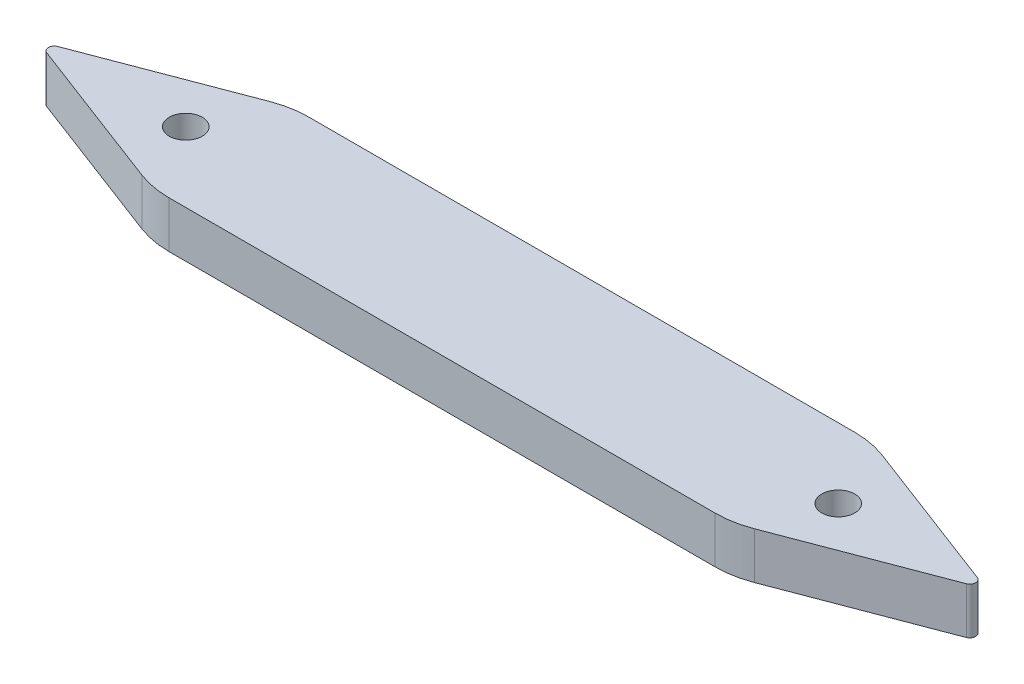
ISO-10303-21;
HEADER;
FILE_DESCRIPTION(('STEP AP214'),'2;1');
FILE_NAME('part.step','',(''),(''),'','','');
FILE_SCHEMA(('AUTOMOTIVE_DESIGN { 1 0 10303 214 1 1 1 1 }'));
ENDSEC;
DATA;
#1=APPLICATION_CONTEXT('core data for automotive mechanical design processes');
#2=APPLICATION_PROTOCOL_DEFINITION('international standard','automotive_design',2000,#1);
#3=PRODUCT_CONTEXT('',#1,'mechanical');
#4=PRODUCT('Part','Part','',(#3));
#5=PRODUCT_RELATED_PRODUCT_CATEGORY('part','',(#4));
#6=PRODUCT_DEFINITION_FORMATION('','',#4);
#7=PRODUCT_DEFINITION_CONTEXT('part definition',#1,'design');
#8=PRODUCT_DEFINITION('design','',#6,#7);
#9=PRODUCT_DEFINITION_SHAPE('','',#8);
#10=(LENGTH_UNIT() NAMED_UNIT(*) SI_UNIT(.MILLI.,.METRE.));
#11=(NAMED_UNIT(*) PLANE_ANGLE_UNIT() SI_UNIT($,.RADIAN.));
#12=(NAMED_UNIT(*) SI_UNIT($,.STERADIAN.) SOLID_ANGLE_UNIT());
#13=UNCERTAINTY_MEASURE_WITH_UNIT(LENGTH_MEASURE(1.E-05),#10,'distance_accuracy_value','');
#14=(GEOMETRIC_REPRESENTATION_CONTEXT(3) GLOBAL_UNCERTAINTY_ASSIGNED_CONTEXT((#13)) GLOBAL_UNIT_ASSIGNED_CONTEXT((#10,
#11,#12)) REPRESENTATION_CONTEXT('',''));
#15=CARTESIAN_POINT('',(0.,0.,0.));
#16=DIRECTION('',(0.,0.,1.));
#17=DIRECTION('',(1.,0.,0.));
#18=AXIS2_PLACEMENT_3D('',#15,#16,#17);
#19=CARTESIAN_POINT('',(-62.3678648511801,-10.,0.));
#20=DIRECTION('',(0.,1.,0.));
#21=DIRECTION('',(0.,0.,1.));
#22=AXIS2_PLACEMENT_3D('',#19,#20,#21);
#23=CYLINDRICAL_SURFACE('',#22,0.793750000000001);
#24=CARTESIAN_POINT('',(-62.3678648511801,3.175,0.));
#25=DIRECTION('',(0.,1.,0.));
#26=DIRECTION('',(0.,0.,1.));
#27=AXIS2_PLACEMENT_3D('',#24,#25,#26);
#28=CIRCLE('',#27,0.793750000000001);
#29=CARTESIAN_POINT('',(-62.6498189486751,3.175,0.741984467092002));
#30=VERTEX_POINT('',#29);
#31=CARTESIAN_POINT('',(-62.6498189486751,3.175,-0.741984467092001));
#32=VERTEX_POINT('',#31);
#33=EDGE_CURVE('E243',#30,#32,#28,.F.);
#34=ORIENTED_EDGE('',*,*,#33,.F.);
#35=DIRECTION('',(0.,1.,0.));
#36=VECTOR('',#35,1.);
#37=CARTESIAN_POINT('',(-62.6498189486751,-10.,0.741984467092001));
#38=LINE('',#37,#36);
#39=CARTESIAN_POINT('',(-62.6498189486751,9.525,0.741984467092002));
#40=VERTEX_POINT('',#39);
#41=EDGE_CURVE('E133',#30,#40,#38,.T.);
#42=ORIENTED_EDGE('',*,*,#41,.T.);
#43=CARTESIAN_POINT('',(-62.3678648511801,9.525,0.));
#44=DIRECTION('',(0.,1.,0.));
#45=DIRECTION('',(0.,0.,1.));
#46=AXIS2_PLACEMENT_3D('',#43,#44,#45);
#47=CIRCLE('',#46,0.793750000000001);
#48=CARTESIAN_POINT('',(-62.6498189486751,9.525,-0.741984467092001));
#49=VERTEX_POINT('',#48);
#50=EDGE_CURVE('E174',#40,#49,#47,.F.);
#51=ORIENTED_EDGE('',*,*,#50,.T.);
#52=DIRECTION('',(0.,1.,0.));
#53=VECTOR('',#52,1.);
#54=CARTESIAN_POINT('',(-62.6498189486751,-10.,-0.741984467092001));
#55=LINE('',#54,#53);
#56=EDGE_CURVE('E151',#32,#49,#55,.T.);
#57=ORIENTED_EDGE('',*,*,#56,.F.);
#58=EDGE_LOOP('',(#34,#42,#51,#57));
#59=FACE_BOUND('',#58,.T.);
#60=ADVANCED_FACE('F33',(#59),#23,.T.);
#61=CARTESIAN_POINT('',(62.3678648511801,-10.,0.));
#62=DIRECTION('',(0.,1.,0.));
#63=DIRECTION('',(0.,0.,1.));
#64=AXIS2_PLACEMENT_3D('',#61,#62,#63);
#65=CYLINDRICAL_SURFACE('',#64,0.793750000000015);
#66=CARTESIAN_POINT('',(62.3678648511801,3.175,0.));
#67=DIRECTION('',(0.,1.,0.));
#68=DIRECTION('',(0.,0.,1.));
#69=AXIS2_PLACEMENT_3D('',#66,#67,#68);
#70=CIRCLE('',#69,0.793750000000015);
#71=CARTESIAN_POINT('',(62.6498189486751,3.175,-0.741984467092032));
#72=VERTEX_POINT('',#71);
#73=CARTESIAN_POINT('',(62.6498189486751,3.175,0.741984467092015));
#74=VERTEX_POINT('',#73);
#75=EDGE_CURVE('E246',#72,#74,#70,.F.);
#76=ORIENTED_EDGE('',*,*,#75,.F.);
#77=DIRECTION('',(0.,1.,0.));
#78=VECTOR('',#77,1.);
#79=CARTESIAN_POINT('',(62.6498189486751,-10.,-0.741984467092032));
#80=LINE('',#79,#78);
#81=CARTESIAN_POINT('',(62.6498189486751,9.525,-0.741984467092015));
#82=VERTEX_POINT('',#81);
#83=EDGE_CURVE('E206',#72,#82,#80,.T.);
#84=ORIENTED_EDGE('',*,*,#83,.T.);
#85=CARTESIAN_POINT('',(62.3678648511801,9.525,0.));
#86=DIRECTION('',(0.,1.,0.));
#87=DIRECTION('',(0.,0.,1.));
#88=AXIS2_PLACEMENT_3D('',#85,#86,#87);
#89=CIRCLE('',#88,0.793750000000015);
#90=CARTESIAN_POINT('',(62.6498189486751,9.525,0.741984467092003));
#91=VERTEX_POINT('',#90);
#92=EDGE_CURVE('E160',#82,#91,#89,.F.);
#93=ORIENTED_EDGE('',*,*,#92,.T.);
#94=DIRECTION('',(0.,1.,0.));
#95=VECTOR('',#94,1.);
#96=CARTESIAN_POINT('',(62.6498189486751,-10.,0.741984467092017));
#97=LINE('',#96,#95);
#98=EDGE_CURVE('E208',#74,#91,#97,.T.);
#99=ORIENTED_EDGE('',*,*,#98,.F.);
#100=EDGE_LOOP('',(#76,#84,#93,#99));
#101=FACE_BOUND('',#100,.T.);
#102=ADVANCED_FACE('F233',(#101),#65,.T.);
#103=CARTESIAN_POINT('',(-41.7162215634645,-10.,-8.69675147347203));
#104=DIRECTION('',(-0.355217760623573,0.,-0.934783580588349));
#105=DIRECTION('',(-0.934783580588349,0.,0.355217760623573));
#106=AXIS2_PLACEMENT_3D('',#103,#104,#105);
#107=PLANE('',#106);
#108=DIRECTION('',(0.934783580588349,0.,-0.355217760623573));
#109=VECTOR('',#108,1.);
#110=CARTESIAN_POINT('',(-41.7162215634645,3.175,-8.69675147347203));
#111=LINE('',#110,#109);
#112=CARTESIAN_POINT('',(-41.7162215634645,3.175,-8.69675147347203));
#113=VERTEX_POINT('',#112);
#114=EDGE_CURVE('E248',#32,#113,#111,.T.);
#115=ORIENTED_EDGE('',*,*,#114,.F.);
#116=ORIENTED_EDGE('',*,*,#56,.T.);
#117=DIRECTION('',(-0.934783580588349,0.,0.355217760623573));
#118=VECTOR('',#117,1.);
#119=CARTESIAN_POINT('',(-41.7162215634645,9.525,-8.69675147347203));
#120=LINE('',#119,#118);
#121=CARTESIAN_POINT('',(-41.7162215634645,9.525,-8.69675147347203));
#122=VERTEX_POINT('',#121);
#123=EDGE_CURVE('E186',#122,#49,#120,.T.);
#124=ORIENTED_EDGE('',*,*,#123,.F.);
#125=DIRECTION('',(0.,1.,0.));
#126=VECTOR('',#125,1.);
#127=CARTESIAN_POINT('',(-41.7162215634645,-10.,-8.69675147347203));
#128=LINE('',#127,#126);
#129=EDGE_CURVE('E198',#113,#122,#128,.T.);
#130=ORIENTED_EDGE('',*,*,#129,.F.);
#131=EDGE_LOOP('',(#115,#116,#124,#130));
#132=FACE_BOUND('',#131,.T.);
#133=ADVANCED_FACE('F239',(#132),#107,.T.);
#134=CARTESIAN_POINT('',(41.7162215634645,-10.,-8.69675147347204));
#135=DIRECTION('',(0.355217760623573,0.,-0.934783580588349));
#136=DIRECTION('',(-0.934783580588349,0.,-0.355217760623573));
#137=AXIS2_PLACEMENT_3D('',#134,#135,#136);
#138=PLANE('',#137);
#139=DIRECTION('',(0.934783580588349,0.,0.355217760623573));
#140=VECTOR('',#139,1.);
#141=CARTESIAN_POINT('',(41.7162215634645,3.175,-8.69675147347204));
#142=LINE('',#141,#140);
#143=CARTESIAN_POINT('',(41.7162215634645,3.175,-8.69675147347204));
#144=VERTEX_POINT('',#143);
#145=EDGE_CURVE('E245',#144,#72,#142,.T.);
#146=ORIENTED_EDGE('',*,*,#145,.F.);
#147=DIRECTION('',(0.,1.,0.));
#148=VECTOR('',#147,1.);
#149=CARTESIAN_POINT('',(41.7162215634645,-10.,-8.69675147347204));
#150=LINE('',#149,#148);
#151=CARTESIAN_POINT('',(41.7162215634645,9.525,-8.69675147347204));
#152=VERTEX_POINT('',#151);
#153=EDGE_CURVE('E204',#144,#152,#150,.T.);
#154=ORIENTED_EDGE('',*,*,#153,.T.);
#155=DIRECTION('',(-0.934783580588349,0.,-0.355217760623573));
#156=VECTOR('',#155,1.);
#157=CARTESIAN_POINT('',(41.7162215634645,9.525,-8.69675147347204));
#158=LINE('',#157,#156);
#159=EDGE_CURVE('E40',#82,#152,#158,.T.);
#160=ORIENTED_EDGE('',*,*,#159,.F.);
#161=ORIENTED_EDGE('',*,*,#83,.F.);
#162=EDGE_LOOP('',(#146,#154,#160,#161));
#163=FACE_BOUND('',#162,.T.);
#164=ADVANCED_FACE('F272',(#163),#138,.T.);
#165=CARTESIAN_POINT('',(41.7162215634645,-10.,8.69675147347204));
#166=DIRECTION('',(0.355217760623573,0.,0.934783580588349));
#167=DIRECTION('',(0.934783580588349,0.,-0.355217760623573));
#168=AXIS2_PLACEMENT_3D('',#165,#166,#167);
#169=PLANE('',#168);
#170=DIRECTION('',(-0.934783580588349,0.,0.355217760623573));
#171=VECTOR('',#170,1.);
#172=CARTESIAN_POINT('',(41.7162215634645,3.175,8.69675147347204));
#173=LINE('',#172,#171);
#174=CARTESIAN_POINT('',(41.7162215634645,3.175,8.69675147347204));
#175=VERTEX_POINT('',#174);
#176=EDGE_CURVE('E134',#74,#175,#173,.T.);
#177=ORIENTED_EDGE('',*,*,#176,.F.);
#178=ORIENTED_EDGE('',*,*,#98,.T.);
#179=DIRECTION('',(0.934783580588349,0.,-0.355217760623573));
#180=VECTOR('',#179,1.);
#181=CARTESIAN_POINT('',(41.7162215634645,9.525,8.69675147347204));
#182=LINE('',#181,#180);
#183=CARTESIAN_POINT('',(41.7162215634645,9.525,8.69675147347204));
#184=VERTEX_POINT('',#183);
#185=EDGE_CURVE('E145',#184,#91,#182,.T.);
#186=ORIENTED_EDGE('',*,*,#185,.F.);
#187=DIRECTION('',(0.,1.,0.));
#188=VECTOR('',#187,1.);
#189=CARTESIAN_POINT('',(41.7162215634645,-10.,8.69675147347204));
#190=LINE('',#189,#188);
#191=EDGE_CURVE('E54',#175,#184,#190,.T.);
#192=ORIENTED_EDGE('',*,*,#191,.F.);
#193=EDGE_LOOP('',(#177,#178,#186,#192));
#194=FACE_BOUND('',#193,.T.);
#195=ADVANCED_FACE('F277',(#194),#169,.T.);
#196=CARTESIAN_POINT('',(-41.7162215634645,-10.,8.69675147347203));
#197=DIRECTION('',(-0.355217760623573,0.,0.934783580588349));
#198=DIRECTION('',(0.934783580588349,0.,0.355217760623573));
#199=AXIS2_PLACEMENT_3D('',#196,#197,#198);
#200=PLANE('',#199);
#201=DIRECTION('',(-0.934783580588349,0.,-0.355217760623573));
#202=VECTOR('',#201,1.);
#203=CARTESIAN_POINT('',(-41.7162215634645,3.175,8.69675147347203));
#204=LINE('',#203,#202);
#205=CARTESIAN_POINT('',(-41.7162215634645,3.175,8.69675147347203));
#206=VERTEX_POINT('',#205);
#207=EDGE_CURVE('E122',#206,#30,#204,.T.);
#208=ORIENTED_EDGE('',*,*,#207,.F.);
#209=DIRECTION('',(0.,1.,0.));
#210=VECTOR('',#209,1.);
#211=CARTESIAN_POINT('',(-41.7162215634645,-10.,8.69675147347203));
#212=LINE('',#211,#210);
#213=CARTESIAN_POINT('',(-41.7162215634645,9.525,8.69675147347203));
#214=VERTEX_POINT('',#213);
#215=EDGE_CURVE('E131',#206,#214,#212,.T.);
#216=ORIENTED_EDGE('',*,*,#215,.T.);
#217=DIRECTION('',(0.934783580588349,0.,0.355217760623573));
#218=VECTOR('',#217,1.);
#219=CARTESIAN_POINT('',(-41.7162215634645,9.525,8.69675147347203));
#220=LINE('',#219,#218);
#221=EDGE_CURVE('E149',#40,#214,#220,.T.);
#222=ORIENTED_EDGE('',*,*,#221,.F.);
#223=ORIENTED_EDGE('',*,*,#41,.F.);
#224=EDGE_LOOP('',(#208,#216,#222,#223));
#225=FACE_BOUND('',#224,.T.);
#226=ADVANCED_FACE('F129',(#225),#200,.T.);
#227=CARTESIAN_POINT('',(44.45,22.225,0.));
#228=DIRECTION('',(0.,1.,0.));
#229=DIRECTION('',(0.,0.,1.));
#230=AXIS2_PLACEMENT_3D('',#227,#228,#229);
#231=CYLINDRICAL_SURFACE('',#230,2.24789999999999);
#232=CARTESIAN_POINT('',(44.45,3.175,0.));
#233=DIRECTION('',(0.,1.,0.));
#234=DIRECTION('',(0.,0.,1.));
#235=AXIS2_PLACEMENT_3D('',#232,#233,#234);
#236=CIRCLE('',#235,2.24789999999999);
#237=CARTESIAN_POINT('',(44.45,3.175,2.24789999999999));
#238=VERTEX_POINT('',#237);
#239=EDGE_CURVE('E156',#238,#238,#236,.F.);
#240=ORIENTED_EDGE('',*,*,#239,.T.);
#241=EDGE_LOOP('',(#240));
#242=FACE_BOUND('',#241,.T.);
#243=CARTESIAN_POINT('',(44.45,9.525,0.));
#244=DIRECTION('',(0.,1.,0.));
#245=DIRECTION('',(0.,0.,1.));
#246=AXIS2_PLACEMENT_3D('',#243,#244,#245);
#247=CIRCLE('',#246,2.24789999999999);
#248=CARTESIAN_POINT('',(44.45,9.525,2.24789999999999));
#249=VERTEX_POINT('',#248);
#250=EDGE_CURVE('E155',#249,#249,#247,.F.);
#251=ORIENTED_EDGE('',*,*,#250,.F.);
#252=EDGE_LOOP('',(#251));
#253=FACE_BOUND('',#252,.T.);
#254=ADVANCED_FACE('F292',(#242,#253),#231,.F.);
#255=CARTESIAN_POINT('',(-44.45,22.225,0.));
#256=DIRECTION('',(0.,1.,0.));
#257=DIRECTION('',(0.,0.,1.));
#258=AXIS2_PLACEMENT_3D('',#255,#256,#257);
#259=CYLINDRICAL_SURFACE('',#258,2.24789999999999);
#260=CARTESIAN_POINT('',(-44.45,3.175,0.));
#261=DIRECTION('',(0.,1.,0.));
#262=DIRECTION('',(0.,0.,1.));
#263=AXIS2_PLACEMENT_3D('',#260,#261,#262);
#264=CIRCLE('',#263,2.24789999999999);
#265=CARTESIAN_POINT('',(-44.45,3.175,2.24789999999999));
#266=VERTEX_POINT('',#265);
#267=EDGE_CURVE('E163',#266,#266,#264,.F.);
#268=ORIENTED_EDGE('',*,*,#267,.T.);
#269=EDGE_LOOP('',(#268));
#270=FACE_BOUND('',#269,.T.);
#271=CARTESIAN_POINT('',(-44.45,9.525,0.));
#272=DIRECTION('',(0.,1.,0.));
#273=DIRECTION('',(0.,0.,1.));
#274=AXIS2_PLACEMENT_3D('',#271,#272,#273);
#275=CIRCLE('',#274,2.24789999999999);
#276=CARTESIAN_POINT('',(-44.45,9.525,2.24789999999999));
#277=VERTEX_POINT('',#276);
#278=EDGE_CURVE('E153',#277,#277,#275,.F.);
#279=ORIENTED_EDGE('',*,*,#278,.F.);
#280=EDGE_LOOP('',(#279));
#281=FACE_BOUND('',#280,.T.);
#282=ADVANCED_FACE('F285',(#270,#281),#259,.F.);
#283=CARTESIAN_POINT('',(-37.2049560035451,-10.,3.17500000000001));
#284=DIRECTION('',(0.,1.,0.));
#285=DIRECTION('',(0.,0.,1.));
#286=AXIS2_PLACEMENT_3D('',#283,#284,#285);
#287=CYLINDRICAL_SURFACE('',#286,12.7);
#288=CARTESIAN_POINT('',(-37.2049560035451,3.175,3.17500000000001));
#289=DIRECTION('',(0.,1.,0.));
#290=DIRECTION('',(0.,0.,1.));
#291=AXIS2_PLACEMENT_3D('',#288,#289,#290);
#292=CIRCLE('',#291,12.7);
#293=CARTESIAN_POINT('',(-37.2049560035451,3.175,-9.52499999999999));
#294=VERTEX_POINT('',#293);
#295=EDGE_CURVE('E168',#113,#294,#292,.F.);
#296=ORIENTED_EDGE('',*,*,#295,.F.);
#297=ORIENTED_EDGE('',*,*,#129,.T.);
#298=CARTESIAN_POINT('',(-37.2049560035451,9.525,3.17500000000001));
#299=DIRECTION('',(0.,-1.,0.));
#300=DIRECTION('',(0.,0.,-1.));
#301=AXIS2_PLACEMENT_3D('',#298,#299,#300);
#302=CIRCLE('',#301,12.7);
#303=CARTESIAN_POINT('',(-37.2049560035451,9.525,-9.525));
#304=VERTEX_POINT('',#303);
#305=EDGE_CURVE('E183',#304,#122,#302,.F.);
#306=ORIENTED_EDGE('',*,*,#305,.F.);
#307=DIRECTION('',(0.,1.,0.));
#308=VECTOR('',#307,1.);
#309=CARTESIAN_POINT('',(-37.2049560035451,-10.,-9.52499999999999));
#310=LINE('',#309,#308);
#311=EDGE_CURVE('E200',#294,#304,#310,.T.);
#312=ORIENTED_EDGE('',*,*,#311,.F.);
#313=EDGE_LOOP('',(#296,#297,#306,#312));
#314=FACE_BOUND('',#313,.T.);
#315=ADVANCED_FACE('F267',(#314),#287,.T.);
#316=CARTESIAN_POINT('',(37.2049560035452,-10.,-9.525));
#317=DIRECTION('',(0.,0.,-1.));
#318=DIRECTION('',(-1.,0.,0.));
#319=AXIS2_PLACEMENT_3D('',#316,#317,#318);
#320=PLANE('',#319);
#321=DIRECTION('',(1.,0.,0.));
#322=VECTOR('',#321,1.);
#323=CARTESIAN_POINT('',(37.2049560035452,3.175,-9.525));
#324=LINE('',#323,#322);
#325=CARTESIAN_POINT('',(37.2049560035452,3.175,-9.525));
#326=VERTEX_POINT('',#325);
#327=EDGE_CURVE('E256',#294,#326,#324,.T.);
#328=ORIENTED_EDGE('',*,*,#327,.F.);
#329=ORIENTED_EDGE('',*,*,#311,.T.);
#330=DIRECTION('',(-1.,0.,0.));
#331=VECTOR('',#330,1.);
#332=CARTESIAN_POINT('',(67.7785323187383,9.525,-9.525));
#333=LINE('',#332,#331);
#334=CARTESIAN_POINT('',(37.2049560035452,9.525,-9.525));
#335=VERTEX_POINT('',#334);
#336=EDGE_CURVE('E177',#335,#304,#333,.T.);
#337=ORIENTED_EDGE('',*,*,#336,.F.);
#338=DIRECTION('',(0.,1.,0.));
#339=VECTOR('',#338,1.);
#340=CARTESIAN_POINT('',(37.2049560035452,-10.,-9.525));
#341=LINE('',#340,#339);
#342=EDGE_CURVE('E202',#326,#335,#341,.T.);
#343=ORIENTED_EDGE('',*,*,#342,.F.);
#344=EDGE_LOOP('',(#328,#329,#337,#343));
#345=FACE_BOUND('',#344,.T.);
#346=ADVANCED_FACE('F228',(#345),#320,.T.);
#347=CARTESIAN_POINT('',(37.2049560035452,-10.,3.17500000000002));
#348=DIRECTION('',(0.,1.,0.));
#349=DIRECTION('',(0.,0.,1.));
#350=AXIS2_PLACEMENT_3D('',#347,#348,#349);
#351=CYLINDRICAL_SURFACE('',#350,12.7);
#352=CARTESIAN_POINT('',(37.2049560035452,3.175,3.17500000000002));
#353=DIRECTION('',(0.,1.,0.));
#354=DIRECTION('',(0.,0.,1.));
#355=AXIS2_PLACEMENT_3D('',#352,#353,#354);
#356=CIRCLE('',#355,12.7);
#357=EDGE_CURVE('E254',#326,#144,#356,.F.);
#358=ORIENTED_EDGE('',*,*,#357,.F.);
#359=ORIENTED_EDGE('',*,*,#342,.T.);
#360=CARTESIAN_POINT('',(37.2049560035452,9.525,3.17500000000002));
#361=DIRECTION('',(0.,-1.,0.));
#362=DIRECTION('',(0.,0.,-1.));
#363=AXIS2_PLACEMENT_3D('',#360,#361,#362);
#364=CIRCLE('',#363,12.7);
#365=EDGE_CURVE('E180',#152,#335,#364,.F.);
#366=ORIENTED_EDGE('',*,*,#365,.F.);
#367=ORIENTED_EDGE('',*,*,#153,.F.);
#368=EDGE_LOOP('',(#358,#359,#366,#367));
#369=FACE_BOUND('',#368,.T.);
#370=ADVANCED_FACE('F221',(#369),#351,.T.);
#371=CARTESIAN_POINT('',(37.2049560035452,-10.,-3.17500000000002));
#372=DIRECTION('',(0.,1.,0.));
#373=DIRECTION('',(0.,0.,1.));
#374=AXIS2_PLACEMENT_3D('',#371,#372,#373);
#375=CYLINDRICAL_SURFACE('',#374,12.7);
#376=CARTESIAN_POINT('',(37.2049560035452,3.175,-3.17500000000002));
#377=DIRECTION('',(0.,1.,0.));
#378=DIRECTION('',(0.,0.,1.));
#379=AXIS2_PLACEMENT_3D('',#376,#377,#378);
#380=CIRCLE('',#379,12.7);
#381=CARTESIAN_POINT('',(37.2049560035452,3.175,9.525));
#382=VERTEX_POINT('',#381);
#383=EDGE_CURVE('E135',#175,#382,#380,.F.);
#384=ORIENTED_EDGE('',*,*,#383,.F.);
#385=ORIENTED_EDGE('',*,*,#191,.T.);
#386=CARTESIAN_POINT('',(37.2049560035452,9.525,-3.17500000000002));
#387=DIRECTION('',(0.,-1.,0.));
#388=DIRECTION('',(0.,0.,-1.));
#389=AXIS2_PLACEMENT_3D('',#386,#387,#388);
#390=CIRCLE('',#389,12.7);
#391=CARTESIAN_POINT('',(37.2049560035452,9.525,9.525));
#392=VERTEX_POINT('',#391);
#393=EDGE_CURVE('E193',#392,#184,#390,.F.);
#394=ORIENTED_EDGE('',*,*,#393,.F.);
#395=DIRECTION('',(0.,1.,0.));
#396=VECTOR('',#395,1.);
#397=CARTESIAN_POINT('',(37.2049560035452,-10.,9.525));
#398=LINE('',#397,#396);
#399=EDGE_CURVE('E143',#382,#392,#398,.T.);
#400=ORIENTED_EDGE('',*,*,#399,.F.);
#401=EDGE_LOOP('',(#384,#385,#394,#400));
#402=FACE_BOUND('',#401,.T.);
#403=ADVANCED_FACE('F219',(#402),#375,.T.);
#404=CARTESIAN_POINT('',(37.2049560035452,-10.,9.525));
#405=DIRECTION('',(0.,0.,1.));
#406=DIRECTION('',(1.,0.,0.));
#407=AXIS2_PLACEMENT_3D('',#404,#405,#406);
#408=PLANE('',#407);
#409=DIRECTION('',(-1.,0.,0.));
#410=VECTOR('',#409,1.);
#411=CARTESIAN_POINT('',(37.2049560035452,3.175,9.525));
#412=LINE('',#411,#410);
#413=CARTESIAN_POINT('',(-37.2049560035451,3.175,9.525));
#414=VERTEX_POINT('',#413);
#415=EDGE_CURVE('E46',#382,#414,#412,.T.);
#416=ORIENTED_EDGE('',*,*,#415,.F.);
#417=ORIENTED_EDGE('',*,*,#399,.T.);
#418=DIRECTION('',(1.,0.,0.));
#419=VECTOR('',#418,1.);
#420=CARTESIAN_POINT('',(-68.6771113456913,9.525,9.525));
#421=LINE('',#420,#419);
#422=CARTESIAN_POINT('',(-37.2049560035451,9.525,9.525));
#423=VERTEX_POINT('',#422);
#424=EDGE_CURVE('E189',#423,#392,#421,.T.);
#425=ORIENTED_EDGE('',*,*,#424,.F.);
#426=DIRECTION('',(0.,1.,0.));
#427=VECTOR('',#426,1.);
#428=CARTESIAN_POINT('',(-37.2049560035451,-10.,9.525));
#429=LINE('',#428,#427);
#430=EDGE_CURVE('E141',#414,#423,#429,.T.);
#431=ORIENTED_EDGE('',*,*,#430,.F.);
#432=EDGE_LOOP('',(#416,#417,#425,#431));
#433=FACE_BOUND('',#432,.T.);
#434=ADVANCED_FACE('F213',(#433),#408,.T.);
#435=CARTESIAN_POINT('',(-37.2049560035451,-10.,-3.17500000000001));
#436=DIRECTION('',(0.,1.,0.));
#437=DIRECTION('',(0.,0.,1.));
#438=AXIS2_PLACEMENT_3D('',#435,#436,#437);
#439=CYLINDRICAL_SURFACE('',#438,12.7);
#440=CARTESIAN_POINT('',(-37.2049560035451,3.175,-3.17500000000001));
#441=DIRECTION('',(0.,1.,0.));
#442=DIRECTION('',(0.,0.,1.));
#443=AXIS2_PLACEMENT_3D('',#440,#441,#442);
#444=CIRCLE('',#443,12.7);
#445=EDGE_CURVE('E11',#414,#206,#444,.F.);
#446=ORIENTED_EDGE('',*,*,#445,.F.);
#447=ORIENTED_EDGE('',*,*,#430,.T.);
#448=CARTESIAN_POINT('',(-37.2049560035451,9.525,-3.17500000000001));
#449=DIRECTION('',(0.,-1.,0.));
#450=DIRECTION('',(0.,0.,-1.));
#451=AXIS2_PLACEMENT_3D('',#448,#449,#450);
#452=CIRCLE('',#451,12.7);
#453=EDGE_CURVE('E140',#214,#423,#452,.F.);
#454=ORIENTED_EDGE('',*,*,#453,.F.);
#455=ORIENTED_EDGE('',*,*,#215,.F.);
#456=EDGE_LOOP('',(#446,#447,#454,#455));
#457=FACE_BOUND('',#456,.T.);
#458=ADVANCED_FACE('F138',(#457),#439,.T.);
#459=CARTESIAN_POINT('',(-68.6771113456913,9.525,4.76249999999999));
#460=DIRECTION('',(0.,-1.,0.));
#461=DIRECTION('',(0.,0.,-1.));
#462=AXIS2_PLACEMENT_3D('',#459,#460,#461);
#463=PLANE('',#462);
#464=ORIENTED_EDGE('',*,*,#92,.F.);
#465=ORIENTED_EDGE('',*,*,#159,.T.);
#466=ORIENTED_EDGE('',*,*,#365,.T.);
#467=ORIENTED_EDGE('',*,*,#336,.T.);
#468=ORIENTED_EDGE('',*,*,#305,.T.);
#469=ORIENTED_EDGE('',*,*,#123,.T.);
#470=ORIENTED_EDGE('',*,*,#50,.F.);
#471=ORIENTED_EDGE('',*,*,#221,.T.);
#472=ORIENTED_EDGE('',*,*,#453,.T.);
#473=ORIENTED_EDGE('',*,*,#424,.T.);
#474=ORIENTED_EDGE('',*,*,#393,.T.);
#475=ORIENTED_EDGE('',*,*,#185,.T.);
#476=EDGE_LOOP('',(#464,#465,#466,#467,#468,#469,#470,#471,#472,#473,#474,#475));
#477=FACE_BOUND('',#476,.T.);
#478=ORIENTED_EDGE('',*,*,#250,.T.);
#479=EDGE_LOOP('',(#478));
#480=FACE_BOUND('',#479,.T.);
#481=ORIENTED_EDGE('',*,*,#278,.T.);
#482=EDGE_LOOP('',(#481));
#483=FACE_BOUND('',#482,.T.);
#484=ADVANCED_FACE('F216',(#477,#480,#483),#463,.F.);
#485=CARTESIAN_POINT('',(0.,3.175,0.));
#486=DIRECTION('',(0.,1.,0.));
#487=DIRECTION('',(0.,0.,1.));
#488=AXIS2_PLACEMENT_3D('',#485,#486,#487);
#489=PLANE('',#488);
#490=ORIENTED_EDGE('',*,*,#267,.F.);
#491=EDGE_LOOP('',(#490));
#492=FACE_BOUND('',#491,.T.);
#493=ORIENTED_EDGE('',*,*,#295,.T.);
#494=ORIENTED_EDGE('',*,*,#327,.T.);
#495=ORIENTED_EDGE('',*,*,#357,.T.);
#496=ORIENTED_EDGE('',*,*,#145,.T.);
#497=ORIENTED_EDGE('',*,*,#75,.T.);
#498=ORIENTED_EDGE('',*,*,#176,.T.);
#499=ORIENTED_EDGE('',*,*,#383,.T.);
#500=ORIENTED_EDGE('',*,*,#415,.T.);
#501=ORIENTED_EDGE('',*,*,#445,.T.);
#502=ORIENTED_EDGE('',*,*,#207,.T.);
#503=ORIENTED_EDGE('',*,*,#33,.T.);
#504=ORIENTED_EDGE('',*,*,#114,.T.);
#505=EDGE_LOOP('',(#493,#494,#495,#496,#497,#498,#499,#500,#501,#502,#503,#504));
#506=FACE_BOUND('',#505,.T.);
#507=ORIENTED_EDGE('',*,*,#239,.F.);
#508=EDGE_LOOP('',(#507));
#509=FACE_BOUND('',#508,.T.);
#510=ADVANCED_FACE('F120',(#492,#506,#509),#489,.F.);
#511=CLOSED_SHELL('',(#60,#102,#133,#164,#195,#226,#254,#282,#315,#346,#370,#403,#434,#458,#484,#510));
#512=MANIFOLD_SOLID_BREP('B2',#511);
#513=ADVANCED_BREP_SHAPE_REPRESENTATION('',(#18,#512),#14);
#514=SHAPE_DEFINITION_REPRESENTATION(#9,#513);
ENDSEC;
END-ISO-10303-21;
